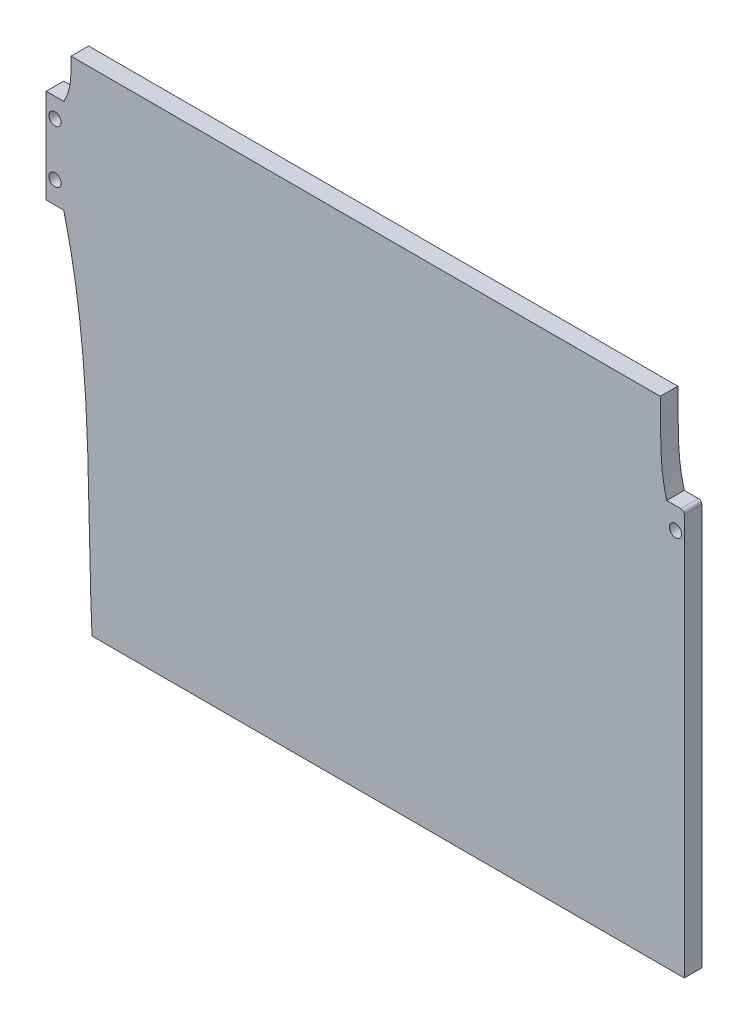
ISO-10303-21;
HEADER;
FILE_DESCRIPTION(('STEP AP214'),'2;1');
FILE_NAME('part.step','',(''),(''),'','','');
FILE_SCHEMA(('AUTOMOTIVE_DESIGN { 1 0 10303 214 1 1 1 1 }'));
ENDSEC;
DATA;
#1=APPLICATION_CONTEXT('core data for automotive mechanical design processes');
#2=APPLICATION_PROTOCOL_DEFINITION('international standard','automotive_design',2000,#1);
#3=PRODUCT_CONTEXT('',#1,'mechanical');
#4=PRODUCT('Part','Part','',(#3));
#5=PRODUCT_RELATED_PRODUCT_CATEGORY('part','',(#4));
#6=PRODUCT_DEFINITION_FORMATION('','',#4);
#7=PRODUCT_DEFINITION_CONTEXT('part definition',#1,'design');
#8=PRODUCT_DEFINITION('design','',#6,#7);
#9=PRODUCT_DEFINITION_SHAPE('','',#8);
#10=(LENGTH_UNIT() NAMED_UNIT(*) SI_UNIT(.MILLI.,.METRE.));
#11=(NAMED_UNIT(*) PLANE_ANGLE_UNIT() SI_UNIT($,.RADIAN.));
#12=(NAMED_UNIT(*) SI_UNIT($,.STERADIAN.) SOLID_ANGLE_UNIT());
#13=UNCERTAINTY_MEASURE_WITH_UNIT(LENGTH_MEASURE(1.E-05),#10,'distance_accuracy_value','');
#14=(GEOMETRIC_REPRESENTATION_CONTEXT(3) GLOBAL_UNCERTAINTY_ASSIGNED_CONTEXT((#13)) GLOBAL_UNIT_ASSIGNED_CONTEXT((#10,
#11,#12)) REPRESENTATION_CONTEXT('',''));
#15=CARTESIAN_POINT('',(0.,0.,0.));
#16=DIRECTION('',(0.,0.,1.));
#17=DIRECTION('',(1.,0.,0.));
#18=AXIS2_PLACEMENT_3D('',#15,#16,#17);
#19=CARTESIAN_POINT('',(-91.8486619536891,-243.228263706772,5.));
#20=DIRECTION('',(0.,0.,-1.));
#21=DIRECTION('',(-1.,0.,0.));
#22=AXIS2_PLACEMENT_3D('',#19,#20,#21);
#23=PLANE('',#22);
#24=CARTESIAN_POINT('',(-91.6662345662699,-236.957982208238,5.));
#25=CARTESIAN_POINT('',(-91.5816556951231,-241.056968832508,5.));
#26=CARTESIAN_POINT('',(-91.5426979926213,-245.516719889446,5.));
#27=CARTESIAN_POINT('',(-93.7500000000098,-249.147061280075,5.));
#28=B_SPLINE_CURVE_WITH_KNOTS('',3,(#24,#25,#26,#27),.UNSPECIFIED.,.F.,.F.,(4,4),(0.,1.),.UNSPECIFIED.);
#29=CARTESIAN_POINT('',(-91.6662345662699,-236.957982208238,5.));
#30=VERTEX_POINT('',#29);
#31=CARTESIAN_POINT('',(-93.7500000000098,-249.147061280075,5.));
#32=VERTEX_POINT('',#31);
#33=EDGE_CURVE('E284',#30,#32,#28,.T.);
#34=ORIENTED_EDGE('',*,*,#33,.T.);
#35=DIRECTION('',(-1.,0.,0.));
#36=VECTOR('',#35,1.);
#37=CARTESIAN_POINT('',(-93.7500000000098,-249.147061280075,5.));
#38=LINE('',#37,#36);
#39=CARTESIAN_POINT('',(-98.7500000000098,-249.147061280075,5.));
#40=VERTEX_POINT('',#39);
#41=EDGE_CURVE('E110',#32,#40,#38,.T.);
#42=ORIENTED_EDGE('',*,*,#41,.T.);
#43=DIRECTION('',(0.,-1.,0.));
#44=VECTOR('',#43,1.);
#45=CARTESIAN_POINT('',(-98.7500000000098,-249.147061280075,5.));
#46=LINE('',#45,#44);
#47=CARTESIAN_POINT('',(-98.7500000000098,-275.963602954775,5.));
#48=VERTEX_POINT('',#47);
#49=EDGE_CURVE('E244',#40,#48,#46,.T.);
#50=ORIENTED_EDGE('',*,*,#49,.T.);
#51=DIRECTION('',(1.,0.,0.));
#52=VECTOR('',#51,1.);
#53=CARTESIAN_POINT('',(-98.7500000000098,-275.963602954775,5.));
#54=LINE('',#53,#52);
#55=CARTESIAN_POINT('',(-93.7500000000098,-275.963602954775,5.));
#56=VERTEX_POINT('',#55);
#57=EDGE_CURVE('E199',#48,#56,#54,.T.);
#58=ORIENTED_EDGE('',*,*,#57,.T.);
#59=CARTESIAN_POINT('',(-93.7500000000098,-275.963602954775,5.));
#60=CARTESIAN_POINT('',(-85.3287841329873,-309.023467031654,5.));
#61=CARTESIAN_POINT('',(-87.2426556090019,-343.164760506526,5.));
#62=CARTESIAN_POINT('',(-85.6961021667644,-376.929671114002,5.));
#63=B_SPLINE_CURVE_WITH_KNOTS('',3,(#59,#60,#61,#62),.UNSPECIFIED.,.F.,.F.,(4,4),(0.,1.),.UNSPECIFIED.);
#64=CARTESIAN_POINT('',(-85.6961021667644,-376.929671114002,5.));
#65=VERTEX_POINT('',#64);
#66=EDGE_CURVE('E192',#56,#65,#63,.T.);
#67=ORIENTED_EDGE('',*,*,#66,.T.);
#68=DIRECTION('',(1.,0.,0.));
#69=VECTOR('',#68,1.);
#70=CARTESIAN_POINT('',(-85.6961021667644,-376.929671114002,5.));
#71=LINE('',#70,#69);
#72=CARTESIAN_POINT('',(82.9000000000002,-376.929671114002,5.));
#73=VERTEX_POINT('',#72);
#74=EDGE_CURVE('E198',#65,#73,#71,.T.);
#75=ORIENTED_EDGE('',*,*,#74,.T.);
#76=CARTESIAN_POINT('',(82.9000000000002,-376.929671114002,5.));
#77=CARTESIAN_POINT('',(82.9000000000002,-342.631616093431,5.));
#78=CARTESIAN_POINT('',(82.9000000000002,-308.333561072859,5.));
#79=CARTESIAN_POINT('',(82.9000000000002,-274.035506052288,5.));
#80=B_SPLINE_CURVE_WITH_KNOTS('',3,(#76,#77,#78,#79),.UNSPECIFIED.,.F.,.F.,(4,4),(0.,1.),.UNSPECIFIED.);
#81=CARTESIAN_POINT('',(82.9000000000002,-274.035506052288,5.));
#82=VERTEX_POINT('',#81);
#83=EDGE_CURVE('E205',#73,#82,#80,.T.);
#84=ORIENTED_EDGE('',*,*,#83,.T.);
#85=DIRECTION('',(0.,1.,0.));
#86=VECTOR('',#85,1.);
#87=CARTESIAN_POINT('',(82.9000000000002,-274.035506052288,5.));
#88=LINE('',#87,#86);
#89=CARTESIAN_POINT('',(82.9000000000002,-262.713680136583,5.));
#90=VERTEX_POINT('',#89);
#91=EDGE_CURVE('E209',#82,#90,#88,.T.);
#92=ORIENTED_EDGE('',*,*,#91,.T.);
#93=CARTESIAN_POINT('',(81.9000000000002,-262.713680136583,5.));
#94=DIRECTION('',(0.,0.,1.));
#95=DIRECTION('',(-1.,0.,0.));
#96=AXIS2_PLACEMENT_3D('',#93,#94,#95);
#97=CIRCLE('',#96,1.);
#98=CARTESIAN_POINT('',(81.9000000000002,-261.713680136583,5.));
#99=VERTEX_POINT('',#98);
#100=EDGE_CURVE('E141',#90,#99,#97,.T.);
#101=ORIENTED_EDGE('',*,*,#100,.T.);
#102=DIRECTION('',(-1.,0.,0.));
#103=VECTOR('',#102,1.);
#104=CARTESIAN_POINT('',(81.9000000000002,-261.713680136583,5.));
#105=LINE('',#104,#103);
#106=CARTESIAN_POINT('',(77.9000000000002,-261.713680136583,5.));
#107=VERTEX_POINT('',#106);
#108=EDGE_CURVE('E135',#99,#107,#105,.T.);
#109=ORIENTED_EDGE('',*,*,#108,.T.);
#110=CARTESIAN_POINT('',(77.9000000000002,-261.713680136583,5.));
#111=CARTESIAN_POINT('',(75.5881984675739,-253.598889885122,5.));
#112=CARTESIAN_POINT('',(76.3401515951062,-245.239667724057,5.));
#113=CARTESIAN_POINT('',(76.0558087670955,-236.957982208238,5.));
#114=B_SPLINE_CURVE_WITH_KNOTS('',3,(#110,#111,#112,#113),.UNSPECIFIED.,.F.,.F.,(4,4),(0.,1.),.UNSPECIFIED.);
#115=CARTESIAN_POINT('',(76.0558087670955,-236.957982208238,5.));
#116=VERTEX_POINT('',#115);
#117=EDGE_CURVE('E139',#107,#116,#114,.T.);
#118=ORIENTED_EDGE('',*,*,#117,.T.);
#119=DIRECTION('',(-1.,0.,0.));
#120=VECTOR('',#119,1.);
#121=CARTESIAN_POINT('',(-91.6662345662699,-236.957982208238,5.));
#122=LINE('',#121,#120);
#123=EDGE_CURVE('E55',#116,#30,#122,.T.);
#124=ORIENTED_EDGE('',*,*,#123,.T.);
#125=EDGE_LOOP('',(#34,#42,#50,#58,#67,#75,#84,#92,#101,#109,#118,#124));
#126=FACE_BOUND('',#125,.T.);
#127=CARTESIAN_POINT('',(-96.2493515508595,-269.713963285883,5.));
#128=DIRECTION('',(0.,0.,1.));
#129=DIRECTION('',(1.,0.,0.));
#130=AXIS2_PLACEMENT_3D('',#127,#128,#129);
#131=CIRCLE('',#130,1.75);
#132=CARTESIAN_POINT('',(-94.4993515508595,-269.713963285883,5.));
#133=VERTEX_POINT('',#132);
#134=EDGE_CURVE('E288',#133,#133,#131,.T.);
#135=ORIENTED_EDGE('',*,*,#134,.F.);
#136=EDGE_LOOP('',(#135));
#137=FACE_BOUND('',#136,.T.);
#138=CARTESIAN_POINT('',(-96.2436541261776,-254.713964367905,5.));
#139=DIRECTION('',(0.,0.,1.));
#140=DIRECTION('',(1.,0.,0.));
#141=AXIS2_PLACEMENT_3D('',#138,#139,#140);
#142=CIRCLE('',#141,1.75);
#143=CARTESIAN_POINT('',(-94.4936541261776,-254.713964367905,5.));
#144=VERTEX_POINT('',#143);
#145=EDGE_CURVE('E300',#144,#144,#142,.T.);
#146=ORIENTED_EDGE('',*,*,#145,.F.);
#147=EDGE_LOOP('',(#146));
#148=FACE_BOUND('',#147,.T.);
#149=CARTESIAN_POINT('',(80.4000000000002,-267.874593094436,5.));
#150=DIRECTION('',(0.,0.,1.));
#151=DIRECTION('',(1.,0.,0.));
#152=AXIS2_PLACEMENT_3D('',#149,#150,#151);
#153=CIRCLE('',#152,1.75);
#154=CARTESIAN_POINT('',(82.1500000000002,-267.874593094436,5.));
#155=VERTEX_POINT('',#154);
#156=EDGE_CURVE('E348',#155,#155,#153,.T.);
#157=ORIENTED_EDGE('',*,*,#156,.F.);
#158=EDGE_LOOP('',(#157));
#159=FACE_BOUND('',#158,.T.);
#160=ADVANCED_FACE('F37',(#126,#137,#148,#159),#23,.F.);
#161=CARTESIAN_POINT('',(-91.8486619536891,-243.228263706772,0.));
#162=DIRECTION('',(0.,0.,-1.));
#163=DIRECTION('',(-1.,0.,0.));
#164=AXIS2_PLACEMENT_3D('',#161,#162,#163);
#165=PLANE('',#164);
#166=CARTESIAN_POINT('',(-96.2436541261776,-254.713964367905,0.));
#167=DIRECTION('',(0.,0.,1.));
#168=DIRECTION('',(1.,0.,0.));
#169=AXIS2_PLACEMENT_3D('',#166,#167,#168);
#170=CIRCLE('',#169,1.75);
#171=CARTESIAN_POINT('',(-94.4936541261776,-254.713964367905,0.));
#172=VERTEX_POINT('',#171);
#173=EDGE_CURVE('E303',#172,#172,#170,.T.);
#174=ORIENTED_EDGE('',*,*,#173,.T.);
#175=EDGE_LOOP('',(#174));
#176=FACE_BOUND('',#175,.T.);
#177=CARTESIAN_POINT('',(-91.6662345662699,-236.957982208238,0.));
#178=CARTESIAN_POINT('',(-91.5816556951231,-241.056968832508,0.));
#179=CARTESIAN_POINT('',(-91.5426979926213,-245.516719889446,0.));
#180=CARTESIAN_POINT('',(-93.7500000000098,-249.147061280075,0.));
#181=B_SPLINE_CURVE_WITH_KNOTS('',3,(#177,#178,#179,#180),.UNSPECIFIED.,.F.,.F.,(4,4),(0.,1.),.UNSPECIFIED.);
#182=CARTESIAN_POINT('',(-91.6662345662699,-236.957982208238,0.));
#183=VERTEX_POINT('',#182);
#184=CARTESIAN_POINT('',(-93.7500000000098,-249.147061280075,0.));
#185=VERTEX_POINT('',#184);
#186=EDGE_CURVE('E256',#183,#185,#181,.T.);
#187=ORIENTED_EDGE('',*,*,#186,.F.);
#188=DIRECTION('',(-1.,0.,0.));
#189=VECTOR('',#188,1.);
#190=CARTESIAN_POINT('',(-91.6662345662699,-236.957982208238,0.));
#191=LINE('',#190,#189);
#192=CARTESIAN_POINT('',(76.0558087670955,-236.957982208238,0.));
#193=VERTEX_POINT('',#192);
#194=EDGE_CURVE('E102',#193,#183,#191,.T.);
#195=ORIENTED_EDGE('',*,*,#194,.F.);
#196=CARTESIAN_POINT('',(77.9000000000002,-261.713680136583,0.));
#197=CARTESIAN_POINT('',(75.5881984675739,-253.598889885122,0.));
#198=CARTESIAN_POINT('',(76.3401515951062,-245.239667724057,0.));
#199=CARTESIAN_POINT('',(76.0558087670955,-236.957982208238,0.));
#200=B_SPLINE_CURVE_WITH_KNOTS('',3,(#196,#197,#198,#199),.UNSPECIFIED.,.F.,.F.,(4,4),(0.,1.),.UNSPECIFIED.);
#201=CARTESIAN_POINT('',(77.9000000000002,-261.713680136583,0.));
#202=VERTEX_POINT('',#201);
#203=EDGE_CURVE('E96',#202,#193,#200,.T.);
#204=ORIENTED_EDGE('',*,*,#203,.F.);
#205=DIRECTION('',(-1.,0.,0.));
#206=VECTOR('',#205,1.);
#207=CARTESIAN_POINT('',(81.9000000000002,-261.713680136583,0.));
#208=LINE('',#207,#206);
#209=CARTESIAN_POINT('',(81.9000000000002,-261.713680136583,0.));
#210=VERTEX_POINT('',#209);
#211=EDGE_CURVE('E149',#210,#202,#208,.T.);
#212=ORIENTED_EDGE('',*,*,#211,.F.);
#213=CARTESIAN_POINT('',(81.9000000000002,-262.713680136583,0.));
#214=DIRECTION('',(0.,0.,1.));
#215=DIRECTION('',(-1.,0.,0.));
#216=AXIS2_PLACEMENT_3D('',#213,#214,#215);
#217=CIRCLE('',#216,1.);
#218=CARTESIAN_POINT('',(82.9000000000002,-262.713680136583,0.));
#219=VERTEX_POINT('',#218);
#220=EDGE_CURVE('E223',#219,#210,#217,.T.);
#221=ORIENTED_EDGE('',*,*,#220,.F.);
#222=DIRECTION('',(0.,1.,0.));
#223=VECTOR('',#222,1.);
#224=CARTESIAN_POINT('',(82.9000000000002,-274.035506052288,0.));
#225=LINE('',#224,#223);
#226=CARTESIAN_POINT('',(82.9000000000002,-274.035506052288,0.));
#227=VERTEX_POINT('',#226);
#228=EDGE_CURVE('E219',#227,#219,#225,.T.);
#229=ORIENTED_EDGE('',*,*,#228,.F.);
#230=CARTESIAN_POINT('',(82.9000000000002,-376.929671114002,0.));
#231=CARTESIAN_POINT('',(82.9000000000002,-342.631616093431,0.));
#232=CARTESIAN_POINT('',(82.9000000000002,-308.333561072859,0.));
#233=CARTESIAN_POINT('',(82.9000000000002,-274.035506052288,0.));
#234=B_SPLINE_CURVE_WITH_KNOTS('',3,(#230,#231,#232,#233),.UNSPECIFIED.,.F.,.F.,(4,4),(0.,1.),.UNSPECIFIED.);
#235=CARTESIAN_POINT('',(82.9000000000002,-376.929671114002,0.));
#236=VERTEX_POINT('',#235);
#237=EDGE_CURVE('E267',#236,#227,#234,.T.);
#238=ORIENTED_EDGE('',*,*,#237,.F.);
#239=DIRECTION('',(1.,0.,0.));
#240=VECTOR('',#239,1.);
#241=CARTESIAN_POINT('',(-85.6961021667644,-376.929671114002,0.));
#242=LINE('',#241,#240);
#243=CARTESIAN_POINT('',(-85.6961021667644,-376.929671114002,0.));
#244=VERTEX_POINT('',#243);
#245=EDGE_CURVE('E262',#244,#236,#242,.T.);
#246=ORIENTED_EDGE('',*,*,#245,.F.);
#247=CARTESIAN_POINT('',(-93.7500000000098,-275.963602954775,0.));
#248=CARTESIAN_POINT('',(-85.3287841329873,-309.023467031654,0.));
#249=CARTESIAN_POINT('',(-87.2426556090019,-343.164760506526,0.));
#250=CARTESIAN_POINT('',(-85.6961021667644,-376.929671114002,0.));
#251=B_SPLINE_CURVE_WITH_KNOTS('',3,(#247,#248,#249,#250),.UNSPECIFIED.,.F.,.F.,(4,4),(0.,1.),.UNSPECIFIED.);
#252=CARTESIAN_POINT('',(-93.7500000000098,-275.963602954775,0.));
#253=VERTEX_POINT('',#252);
#254=EDGE_CURVE('E254',#253,#244,#251,.T.);
#255=ORIENTED_EDGE('',*,*,#254,.F.);
#256=DIRECTION('',(1.,0.,0.));
#257=VECTOR('',#256,1.);
#258=CARTESIAN_POINT('',(-98.7500000000098,-275.963602954775,0.));
#259=LINE('',#258,#257);
#260=CARTESIAN_POINT('',(-98.7500000000098,-275.963602954775,0.));
#261=VERTEX_POINT('',#260);
#262=EDGE_CURVE('E252',#261,#253,#259,.T.);
#263=ORIENTED_EDGE('',*,*,#262,.F.);
#264=DIRECTION('',(0.,-1.,0.));
#265=VECTOR('',#264,1.);
#266=CARTESIAN_POINT('',(-98.7500000000098,-249.147061280075,0.));
#267=LINE('',#266,#265);
#268=CARTESIAN_POINT('',(-98.7500000000098,-249.147061280075,0.));
#269=VERTEX_POINT('',#268);
#270=EDGE_CURVE('E243',#269,#261,#267,.T.);
#271=ORIENTED_EDGE('',*,*,#270,.F.);
#272=DIRECTION('',(-1.,0.,0.));
#273=VECTOR('',#272,1.);
#274=CARTESIAN_POINT('',(-93.7500000000098,-249.147061280075,0.));
#275=LINE('',#274,#273);
#276=EDGE_CURVE('E250',#185,#269,#275,.T.);
#277=ORIENTED_EDGE('',*,*,#276,.F.);
#278=EDGE_LOOP('',(#187,#195,#204,#212,#221,#229,#238,#246,#255,#263,#271,#277));
#279=FACE_BOUND('',#278,.T.);
#280=CARTESIAN_POINT('',(-96.2493515508595,-269.713963285883,0.));
#281=DIRECTION('',(0.,0.,1.));
#282=DIRECTION('',(1.,0.,0.));
#283=AXIS2_PLACEMENT_3D('',#280,#281,#282);
#284=CIRCLE('',#283,1.75);
#285=CARTESIAN_POINT('',(-94.4993515508595,-269.713963285883,0.));
#286=VERTEX_POINT('',#285);
#287=EDGE_CURVE('E290',#286,#286,#284,.T.);
#288=ORIENTED_EDGE('',*,*,#287,.T.);
#289=EDGE_LOOP('',(#288));
#290=FACE_BOUND('',#289,.T.);
#291=CARTESIAN_POINT('',(80.4000000000002,-267.874593094436,0.));
#292=DIRECTION('',(0.,0.,1.));
#293=DIRECTION('',(1.,0.,0.));
#294=AXIS2_PLACEMENT_3D('',#291,#292,#293);
#295=CIRCLE('',#294,1.75);
#296=CARTESIAN_POINT('',(82.1500000000002,-267.874593094436,0.));
#297=VERTEX_POINT('',#296);
#298=EDGE_CURVE('E351',#297,#297,#295,.T.);
#299=ORIENTED_EDGE('',*,*,#298,.T.);
#300=EDGE_LOOP('',(#299));
#301=FACE_BOUND('',#300,.T.);
#302=ADVANCED_FACE('F248',(#176,#279,#290,#301),#165,.T.);
#303=DIRECTION('',(0.,0.,-1.));
#304=VECTOR('',#303,1.);
#305=SURFACE_OF_LINEAR_EXTRUSION('',#28,#304);
#306=ORIENTED_EDGE('',*,*,#186,.T.);
#307=DIRECTION('',(0.,0.,-1.));
#308=VECTOR('',#307,1.);
#309=CARTESIAN_POINT('',(-93.7500000000098,-249.147061280075,5.));
#310=LINE('',#309,#308);
#311=EDGE_CURVE('E11',#32,#185,#310,.T.);
#312=ORIENTED_EDGE('',*,*,#311,.F.);
#313=ORIENTED_EDGE('',*,*,#33,.F.);
#314=DIRECTION('',(0.,0.,-1.));
#315=VECTOR('',#314,1.);
#316=CARTESIAN_POINT('',(-91.6662345662699,-236.957982208238,5.));
#317=LINE('',#316,#315);
#318=EDGE_CURVE('E155',#30,#183,#317,.T.);
#319=ORIENTED_EDGE('',*,*,#318,.T.);
#320=EDGE_LOOP('',(#306,#312,#313,#319));
#321=FACE_BOUND('',#320,.T.);
#322=ADVANCED_FACE('F39',(#321),#305,.F.);
#323=CARTESIAN_POINT('',(-93.7500000000098,-249.147061280075,5.));
#324=DIRECTION('',(0.,-1.,0.));
#325=DIRECTION('',(0.,0.,-1.));
#326=AXIS2_PLACEMENT_3D('',#323,#324,#325);
#327=PLANE('',#326);
#328=ORIENTED_EDGE('',*,*,#276,.T.);
#329=DIRECTION('',(0.,0.,-1.));
#330=VECTOR('',#329,1.);
#331=CARTESIAN_POINT('',(-98.7500000000098,-249.147061280075,5.));
#332=LINE('',#331,#330);
#333=EDGE_CURVE('E47',#40,#269,#332,.T.);
#334=ORIENTED_EDGE('',*,*,#333,.F.);
#335=ORIENTED_EDGE('',*,*,#41,.F.);
#336=ORIENTED_EDGE('',*,*,#311,.T.);
#337=EDGE_LOOP('',(#328,#334,#335,#336));
#338=FACE_BOUND('',#337,.T.);
#339=ADVANCED_FACE('F325',(#338),#327,.F.);
#340=CARTESIAN_POINT('',(-98.7500000000098,-249.147061280075,5.));
#341=DIRECTION('',(1.,0.,0.));
#342=DIRECTION('',(0.,0.,-1.));
#343=AXIS2_PLACEMENT_3D('',#340,#341,#342);
#344=PLANE('',#343);
#345=ORIENTED_EDGE('',*,*,#270,.T.);
#346=DIRECTION('',(0.,0.,-1.));
#347=VECTOR('',#346,1.);
#348=CARTESIAN_POINT('',(-98.7500000000098,-275.963602954775,5.));
#349=LINE('',#348,#347);
#350=EDGE_CURVE('E235',#48,#261,#349,.T.);
#351=ORIENTED_EDGE('',*,*,#350,.F.);
#352=ORIENTED_EDGE('',*,*,#49,.F.);
#353=ORIENTED_EDGE('',*,*,#333,.T.);
#354=EDGE_LOOP('',(#345,#351,#352,#353));
#355=FACE_BOUND('',#354,.T.);
#356=ADVANCED_FACE('F241',(#355),#344,.F.);
#357=CARTESIAN_POINT('',(-98.7500000000098,-275.963602954775,5.));
#358=DIRECTION('',(0.,1.,0.));
#359=DIRECTION('',(0.,0.,1.));
#360=AXIS2_PLACEMENT_3D('',#357,#358,#359);
#361=PLANE('',#360);
#362=ORIENTED_EDGE('',*,*,#262,.T.);
#363=DIRECTION('',(0.,0.,-1.));
#364=VECTOR('',#363,1.);
#365=CARTESIAN_POINT('',(-93.7500000000098,-275.963602954775,5.));
#366=LINE('',#365,#364);
#367=EDGE_CURVE('E232',#56,#253,#366,.T.);
#368=ORIENTED_EDGE('',*,*,#367,.F.);
#369=ORIENTED_EDGE('',*,*,#57,.F.);
#370=ORIENTED_EDGE('',*,*,#350,.T.);
#371=EDGE_LOOP('',(#362,#368,#369,#370));
#372=FACE_BOUND('',#371,.T.);
#373=ADVANCED_FACE('F189',(#372),#361,.F.);
#374=DIRECTION('',(0.,0.,-1.));
#375=VECTOR('',#374,1.);
#376=SURFACE_OF_LINEAR_EXTRUSION('',#63,#375);
#377=ORIENTED_EDGE('',*,*,#254,.T.);
#378=DIRECTION('',(0.,0.,-1.));
#379=VECTOR('',#378,1.);
#380=CARTESIAN_POINT('',(-85.6961021667644,-376.929671114002,5.));
#381=LINE('',#380,#379);
#382=EDGE_CURVE('E229',#65,#244,#381,.T.);
#383=ORIENTED_EDGE('',*,*,#382,.F.);
#384=ORIENTED_EDGE('',*,*,#66,.F.);
#385=ORIENTED_EDGE('',*,*,#367,.T.);
#386=EDGE_LOOP('',(#377,#383,#384,#385));
#387=FACE_BOUND('',#386,.T.);
#388=ADVANCED_FACE('F184',(#387),#376,.F.);
#389=CARTESIAN_POINT('',(-85.6961021667644,-376.929671114002,5.));
#390=DIRECTION('',(0.,1.,0.));
#391=DIRECTION('',(0.,0.,1.));
#392=AXIS2_PLACEMENT_3D('',#389,#390,#391);
#393=PLANE('',#392);
#394=ORIENTED_EDGE('',*,*,#245,.T.);
#395=DIRECTION('',(0.,0.,-1.));
#396=VECTOR('',#395,1.);
#397=CARTESIAN_POINT('',(82.9000000000002,-376.929671114002,5.));
#398=LINE('',#397,#396);
#399=EDGE_CURVE('E221',#73,#236,#398,.T.);
#400=ORIENTED_EDGE('',*,*,#399,.F.);
#401=ORIENTED_EDGE('',*,*,#74,.F.);
#402=ORIENTED_EDGE('',*,*,#382,.T.);
#403=EDGE_LOOP('',(#394,#400,#401,#402));
#404=FACE_BOUND('',#403,.T.);
#405=ADVANCED_FACE('F180',(#404),#393,.F.);
#406=CARTESIAN_POINT('',(82.9000000000002,-274.035506052288,5.));
#407=DIRECTION('',(-1.,0.,0.));
#408=DIRECTION('',(0.,0.,1.));
#409=AXIS2_PLACEMENT_3D('',#406,#407,#408);
#410=PLANE('',#409);
#411=ORIENTED_EDGE('',*,*,#228,.T.);
#412=DIRECTION('',(0.,0.,-1.));
#413=VECTOR('',#412,1.);
#414=CARTESIAN_POINT('',(82.9000000000002,-262.713680136583,5.));
#415=LINE('',#414,#413);
#416=EDGE_CURVE('E217',#90,#219,#415,.T.);
#417=ORIENTED_EDGE('',*,*,#416,.F.);
#418=ORIENTED_EDGE('',*,*,#91,.F.);
#419=ORIENTED_EDGE('',*,*,#83,.F.);
#420=ORIENTED_EDGE('',*,*,#399,.T.);
#421=ORIENTED_EDGE('',*,*,#237,.T.);
#422=EDGE_LOOP('',(#411,#417,#418,#419,#420,#421));
#423=FACE_BOUND('',#422,.T.);
#424=ADVANCED_FACE('F176',(#423),#410,.F.);
#425=CARTESIAN_POINT('',(81.9000000000002,-262.713680136583,5.));
#426=DIRECTION('',(0.,0.,-1.));
#427=DIRECTION('',(-1.,0.,0.));
#428=AXIS2_PLACEMENT_3D('',#425,#426,#427);
#429=CYLINDRICAL_SURFACE('',#428,1.);
#430=ORIENTED_EDGE('',*,*,#220,.T.);
#431=DIRECTION('',(0.,0.,-1.));
#432=VECTOR('',#431,1.);
#433=CARTESIAN_POINT('',(81.9000000000002,-261.713680136583,5.));
#434=LINE('',#433,#432);
#435=EDGE_CURVE('E150',#99,#210,#434,.T.);
#436=ORIENTED_EDGE('',*,*,#435,.F.);
#437=ORIENTED_EDGE('',*,*,#100,.F.);
#438=ORIENTED_EDGE('',*,*,#416,.T.);
#439=EDGE_LOOP('',(#430,#436,#437,#438));
#440=FACE_BOUND('',#439,.T.);
#441=ADVANCED_FACE('F173',(#440),#429,.T.);
#442=CARTESIAN_POINT('',(81.9000000000002,-261.713680136583,5.));
#443=DIRECTION('',(0.,-1.,0.));
#444=DIRECTION('',(0.,0.,-1.));
#445=AXIS2_PLACEMENT_3D('',#442,#443,#444);
#446=PLANE('',#445);
#447=ORIENTED_EDGE('',*,*,#211,.T.);
#448=DIRECTION('',(0.,0.,-1.));
#449=VECTOR('',#448,1.);
#450=CARTESIAN_POINT('',(77.9000000000002,-261.713680136583,5.));
#451=LINE('',#450,#449);
#452=EDGE_CURVE('E146',#107,#202,#451,.T.);
#453=ORIENTED_EDGE('',*,*,#452,.F.);
#454=ORIENTED_EDGE('',*,*,#108,.F.);
#455=ORIENTED_EDGE('',*,*,#435,.T.);
#456=EDGE_LOOP('',(#447,#453,#454,#455));
#457=FACE_BOUND('',#456,.T.);
#458=ADVANCED_FACE('F147',(#457),#446,.F.);
#459=DIRECTION('',(0.,0.,-1.));
#460=VECTOR('',#459,1.);
#461=SURFACE_OF_LINEAR_EXTRUSION('',#114,#460);
#462=ORIENTED_EDGE('',*,*,#203,.T.);
#463=DIRECTION('',(0.,0.,-1.));
#464=VECTOR('',#463,1.);
#465=CARTESIAN_POINT('',(76.0558087670955,-236.957982208238,5.));
#466=LINE('',#465,#464);
#467=EDGE_CURVE('E151',#116,#193,#466,.T.);
#468=ORIENTED_EDGE('',*,*,#467,.F.);
#469=ORIENTED_EDGE('',*,*,#117,.F.);
#470=ORIENTED_EDGE('',*,*,#452,.T.);
#471=EDGE_LOOP('',(#462,#468,#469,#470));
#472=FACE_BOUND('',#471,.T.);
#473=ADVANCED_FACE('F153',(#472),#461,.F.);
#474=CARTESIAN_POINT('',(-91.6662345662699,-236.957982208238,5.));
#475=DIRECTION('',(0.,-1.,0.));
#476=DIRECTION('',(0.,0.,-1.));
#477=AXIS2_PLACEMENT_3D('',#474,#475,#476);
#478=PLANE('',#477);
#479=ORIENTED_EDGE('',*,*,#194,.T.);
#480=ORIENTED_EDGE('',*,*,#318,.F.);
#481=ORIENTED_EDGE('',*,*,#123,.F.);
#482=ORIENTED_EDGE('',*,*,#467,.T.);
#483=EDGE_LOOP('',(#479,#480,#481,#482));
#484=FACE_BOUND('',#483,.T.);
#485=ADVANCED_FACE('F169',(#484),#478,.F.);
#486=CARTESIAN_POINT('',(-96.2493515508595,-269.713963285883,5.));
#487=DIRECTION('',(0.,0.,-1.));
#488=DIRECTION('',(-1.,0.,0.));
#489=AXIS2_PLACEMENT_3D('',#486,#487,#488);
#490=CYLINDRICAL_SURFACE('',#489,1.75);
#491=ORIENTED_EDGE('',*,*,#134,.T.);
#492=EDGE_LOOP('',(#491));
#493=FACE_BOUND('',#492,.T.);
#494=ORIENTED_EDGE('',*,*,#287,.F.);
#495=EDGE_LOOP('',(#494));
#496=FACE_BOUND('',#495,.T.);
#497=ADVANCED_FACE('F333',(#493,#496),#490,.F.);
#498=CARTESIAN_POINT('',(-96.2436541261776,-254.713964367905,5.));
#499=DIRECTION('',(0.,0.,-1.));
#500=DIRECTION('',(-1.,0.,0.));
#501=AXIS2_PLACEMENT_3D('',#498,#499,#500);
#502=CYLINDRICAL_SURFACE('',#501,1.75);
#503=ORIENTED_EDGE('',*,*,#145,.T.);
#504=EDGE_LOOP('',(#503));
#505=FACE_BOUND('',#504,.T.);
#506=ORIENTED_EDGE('',*,*,#173,.F.);
#507=EDGE_LOOP('',(#506));
#508=FACE_BOUND('',#507,.T.);
#509=ADVANCED_FACE('F336',(#505,#508),#502,.F.);
#510=CARTESIAN_POINT('',(80.4000000000002,-267.874593094436,5.));
#511=DIRECTION('',(0.,0.,-1.));
#512=DIRECTION('',(-1.,0.,0.));
#513=AXIS2_PLACEMENT_3D('',#510,#511,#512);
#514=CYLINDRICAL_SURFACE('',#513,1.75);
#515=ORIENTED_EDGE('',*,*,#156,.T.);
#516=EDGE_LOOP('',(#515));
#517=FACE_BOUND('',#516,.T.);
#518=ORIENTED_EDGE('',*,*,#298,.F.);
#519=EDGE_LOOP('',(#518));
#520=FACE_BOUND('',#519,.T.);
#521=ADVANCED_FACE('F339',(#517,#520),#514,.F.);
#522=CLOSED_SHELL('',(#160,#302,#322,#339,#356,#373,#388,#405,#424,#441,#458,#473,#485,#497,
#509,#521));
#523=MANIFOLD_SOLID_BREP('B2',#522);
#524=ADVANCED_BREP_SHAPE_REPRESENTATION('',(#18,#523),#14);
#525=SHAPE_DEFINITION_REPRESENTATION(#9,#524);
ENDSEC;
END-ISO-10303-21;
